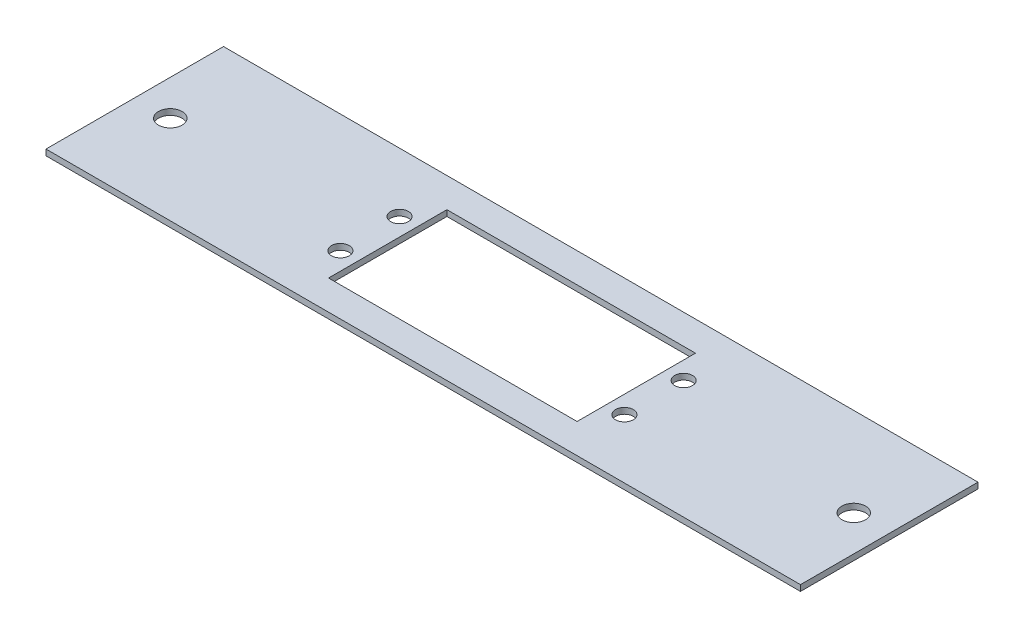
ISO-10303-21;
HEADER;
FILE_DESCRIPTION(('STEP AP214'),'2;1');
FILE_NAME('part.step','',(''),(''),'','','');
FILE_SCHEMA(('AUTOMOTIVE_DESIGN { 1 0 10303 214 1 1 1 1 }'));
ENDSEC;
DATA;
#1=APPLICATION_CONTEXT('core data for automotive mechanical design processes');
#2=APPLICATION_PROTOCOL_DEFINITION('international standard','automotive_design',2000,#1);
#3=PRODUCT_CONTEXT('',#1,'mechanical');
#4=PRODUCT('Part','Part','',(#3));
#5=PRODUCT_RELATED_PRODUCT_CATEGORY('part','',(#4));
#6=PRODUCT_DEFINITION_FORMATION('','',#4);
#7=PRODUCT_DEFINITION_CONTEXT('part definition',#1,'design');
#8=PRODUCT_DEFINITION('design','',#6,#7);
#9=PRODUCT_DEFINITION_SHAPE('','',#8);
#10=(LENGTH_UNIT() NAMED_UNIT(*) SI_UNIT(.MILLI.,.METRE.));
#11=(NAMED_UNIT(*) PLANE_ANGLE_UNIT() SI_UNIT($,.RADIAN.));
#12=(NAMED_UNIT(*) SI_UNIT($,.STERADIAN.) SOLID_ANGLE_UNIT());
#13=UNCERTAINTY_MEASURE_WITH_UNIT(LENGTH_MEASURE(1.E-05),#10,'distance_accuracy_value','');
#14=(GEOMETRIC_REPRESENTATION_CONTEXT(3) GLOBAL_UNCERTAINTY_ASSIGNED_CONTEXT((#13)) GLOBAL_UNIT_ASSIGNED_CONTEXT((#10,
#11,#12)) REPRESENTATION_CONTEXT('',''));
#15=CARTESIAN_POINT('',(0.,0.,0.));
#16=DIRECTION('',(0.,0.,1.));
#17=DIRECTION('',(1.,0.,0.));
#18=AXIS2_PLACEMENT_3D('',#15,#16,#17);
#19=CARTESIAN_POINT('',(0.,1.,0.));
#20=DIRECTION('',(0.,1.,0.));
#21=DIRECTION('',(0.,0.,1.));
#22=AXIS2_PLACEMENT_3D('',#19,#20,#21);
#23=PLANE('',#22);
#24=CARTESIAN_POINT('',(24.,1.,-5.));
#25=DIRECTION('',(0.,1.,0.));
#26=DIRECTION('',(0.,0.,-1.));
#27=AXIS2_PLACEMENT_3D('',#24,#25,#26);
#28=CIRCLE('',#27,1.49999999999999);
#29=CARTESIAN_POINT('',(24.,1.,-6.5));
#30=VERTEX_POINT('',#29);
#31=EDGE_CURVE('E298',#30,#30,#28,.T.);
#32=ORIENTED_EDGE('',*,*,#31,.F.);
#33=EDGE_LOOP('',(#32));
#34=FACE_BOUND('',#33,.T.);
#35=CARTESIAN_POINT('',(24.,1.,4.99999999999999));
#36=DIRECTION('',(0.,1.,0.));
#37=DIRECTION('',(0.,0.,1.));
#38=AXIS2_PLACEMENT_3D('',#35,#36,#37);
#39=CIRCLE('',#38,1.5);
#40=CARTESIAN_POINT('',(24.,1.,6.49999999999999));
#41=VERTEX_POINT('',#40);
#42=EDGE_CURVE('E288',#41,#41,#39,.T.);
#43=ORIENTED_EDGE('',*,*,#42,.F.);
#44=EDGE_LOOP('',(#43));
#45=FACE_BOUND('',#44,.T.);
#46=CARTESIAN_POINT('',(-24.,1.,5.));
#47=DIRECTION('',(0.,1.,0.));
#48=DIRECTION('',(0.,0.,-1.));
#49=AXIS2_PLACEMENT_3D('',#46,#47,#48);
#50=CIRCLE('',#49,1.5);
#51=CARTESIAN_POINT('',(-24.,1.,3.5));
#52=VERTEX_POINT('',#51);
#53=EDGE_CURVE('E278',#52,#52,#50,.T.);
#54=ORIENTED_EDGE('',*,*,#53,.F.);
#55=EDGE_LOOP('',(#54));
#56=FACE_BOUND('',#55,.T.);
#57=CARTESIAN_POINT('',(-24.,1.,-5.));
#58=DIRECTION('',(0.,1.,0.));
#59=DIRECTION('',(0.,0.,1.));
#60=AXIS2_PLACEMENT_3D('',#57,#58,#59);
#61=CIRCLE('',#60,1.5);
#62=CARTESIAN_POINT('',(-24.,1.,-3.5));
#63=VERTEX_POINT('',#62);
#64=EDGE_CURVE('E285',#63,#63,#61,.T.);
#65=ORIENTED_EDGE('',*,*,#64,.F.);
#66=EDGE_LOOP('',(#65));
#67=FACE_BOUND('',#66,.T.);
#68=CARTESIAN_POINT('',(-57.75,1.,0.));
#69=DIRECTION('',(0.,1.,0.));
#70=DIRECTION('',(0.,0.,1.));
#71=AXIS2_PLACEMENT_3D('',#68,#69,#70);
#72=CIRCLE('',#71,2.);
#73=CARTESIAN_POINT('',(-57.75,1.,2.));
#74=VERTEX_POINT('',#73);
#75=EDGE_CURVE('E140',#74,#74,#72,.T.);
#76=ORIENTED_EDGE('',*,*,#75,.F.);
#77=EDGE_LOOP('',(#76));
#78=FACE_BOUND('',#77,.T.);
#79=DIRECTION('',(0.,0.,1.));
#80=VECTOR('',#79,1.);
#81=CARTESIAN_POINT('',(-63.75,1.,-15.));
#82=LINE('',#81,#80);
#83=CARTESIAN_POINT('',(-63.75,1.,-15.));
#84=VERTEX_POINT('',#83);
#85=CARTESIAN_POINT('',(-63.75,1.,15.));
#86=VERTEX_POINT('',#85);
#87=EDGE_CURVE('E156',#84,#86,#82,.T.);
#88=ORIENTED_EDGE('',*,*,#87,.T.);
#89=DIRECTION('',(1.,0.,0.));
#90=VECTOR('',#89,1.);
#91=CARTESIAN_POINT('',(-63.75,1.,15.));
#92=LINE('',#91,#90);
#93=CARTESIAN_POINT('',(63.75,1.,15.));
#94=VERTEX_POINT('',#93);
#95=EDGE_CURVE('E160',#86,#94,#92,.T.);
#96=ORIENTED_EDGE('',*,*,#95,.T.);
#97=DIRECTION('',(0.,0.,-1.));
#98=VECTOR('',#97,1.);
#99=CARTESIAN_POINT('',(63.75,1.,-15.));
#100=LINE('',#99,#98);
#101=CARTESIAN_POINT('',(63.75,1.,-15.));
#102=VERTEX_POINT('',#101);
#103=EDGE_CURVE('E164',#94,#102,#100,.T.);
#104=ORIENTED_EDGE('',*,*,#103,.T.);
#105=DIRECTION('',(-1.,0.,0.));
#106=VECTOR('',#105,1.);
#107=CARTESIAN_POINT('',(-63.75,1.,-15.));
#108=LINE('',#107,#106);
#109=EDGE_CURVE('E167',#102,#84,#108,.T.);
#110=ORIENTED_EDGE('',*,*,#109,.T.);
#111=EDGE_LOOP('',(#88,#96,#104,#110));
#112=FACE_BOUND('',#111,.T.);
#113=DIRECTION('',(-1.,0.,0.));
#114=VECTOR('',#113,1.);
#115=CARTESIAN_POINT('',(-21.,1.,-10.));
#116=LINE('',#115,#114);
#117=CARTESIAN_POINT('',(21.,1.,-10.));
#118=VERTEX_POINT('',#117);
#119=CARTESIAN_POINT('',(-21.,1.,-10.));
#120=VERTEX_POINT('',#119);
#121=EDGE_CURVE('E114',#118,#120,#116,.T.);
#122=ORIENTED_EDGE('',*,*,#121,.F.);
#123=DIRECTION('',(0.,0.,-1.));
#124=VECTOR('',#123,1.);
#125=CARTESIAN_POINT('',(21.,1.,10.));
#126=LINE('',#125,#124);
#127=CARTESIAN_POINT('',(21.,1.,10.));
#128=VERTEX_POINT('',#127);
#129=EDGE_CURVE('E105',#128,#118,#126,.T.);
#130=ORIENTED_EDGE('',*,*,#129,.F.);
#131=DIRECTION('',(1.,0.,0.));
#132=VECTOR('',#131,1.);
#133=CARTESIAN_POINT('',(-21.,1.,10.));
#134=LINE('',#133,#132);
#135=CARTESIAN_POINT('',(-21.,1.,10.));
#136=VERTEX_POINT('',#135);
#137=EDGE_CURVE('E132',#136,#128,#134,.T.);
#138=ORIENTED_EDGE('',*,*,#137,.F.);
#139=DIRECTION('',(0.,0.,1.));
#140=VECTOR('',#139,1.);
#141=CARTESIAN_POINT('',(-21.,1.,10.));
#142=LINE('',#141,#140);
#143=EDGE_CURVE('E128',#120,#136,#142,.T.);
#144=ORIENTED_EDGE('',*,*,#143,.F.);
#145=EDGE_LOOP('',(#122,#130,#138,#144));
#146=FACE_BOUND('',#145,.T.);
#147=CARTESIAN_POINT('',(57.75,1.,0.));
#148=DIRECTION('',(0.,1.,0.));
#149=DIRECTION('',(0.,0.,-1.));
#150=AXIS2_PLACEMENT_3D('',#147,#148,#149);
#151=CIRCLE('',#150,2.00000000000002);
#152=CARTESIAN_POINT('',(57.75,1.,-2.00000000000003));
#153=VERTEX_POINT('',#152);
#154=EDGE_CURVE('E310',#153,#153,#151,.T.);
#155=ORIENTED_EDGE('',*,*,#154,.F.);
#156=EDGE_LOOP('',(#155));
#157=FACE_BOUND('',#156,.T.);
#158=ADVANCED_FACE('F39',(#34,#45,#56,#67,#78,#112,#146,#157),#23,.T.);
#159=CARTESIAN_POINT('',(0.,0.,0.));
#160=DIRECTION('',(0.,1.,0.));
#161=DIRECTION('',(0.,0.,1.));
#162=AXIS2_PLACEMENT_3D('',#159,#160,#161);
#163=PLANE('',#162);
#164=CARTESIAN_POINT('',(24.,0.,-5.));
#165=DIRECTION('',(0.,1.,0.));
#166=DIRECTION('',(0.,0.,-1.));
#167=AXIS2_PLACEMENT_3D('',#164,#165,#166);
#168=CIRCLE('',#167,1.49999999999999);
#169=CARTESIAN_POINT('',(24.,0.,-6.5));
#170=VERTEX_POINT('',#169);
#171=EDGE_CURVE('E294',#170,#170,#168,.T.);
#172=ORIENTED_EDGE('',*,*,#171,.T.);
#173=EDGE_LOOP('',(#172));
#174=FACE_BOUND('',#173,.T.);
#175=CARTESIAN_POINT('',(24.,0.,4.99999999999999));
#176=DIRECTION('',(0.,1.,0.));
#177=DIRECTION('',(0.,0.,1.));
#178=AXIS2_PLACEMENT_3D('',#175,#176,#177);
#179=CIRCLE('',#178,1.5);
#180=CARTESIAN_POINT('',(24.,0.,6.49999999999999));
#181=VERTEX_POINT('',#180);
#182=EDGE_CURVE('E281',#181,#181,#179,.T.);
#183=ORIENTED_EDGE('',*,*,#182,.T.);
#184=EDGE_LOOP('',(#183));
#185=FACE_BOUND('',#184,.T.);
#186=CARTESIAN_POINT('',(-24.,0.,5.));
#187=DIRECTION('',(0.,1.,0.));
#188=DIRECTION('',(0.,0.,-1.));
#189=AXIS2_PLACEMENT_3D('',#186,#187,#188);
#190=CIRCLE('',#189,1.5);
#191=CARTESIAN_POINT('',(-24.,0.,3.5));
#192=VERTEX_POINT('',#191);
#193=EDGE_CURVE('E275',#192,#192,#190,.T.);
#194=ORIENTED_EDGE('',*,*,#193,.T.);
#195=EDGE_LOOP('',(#194));
#196=FACE_BOUND('',#195,.T.);
#197=CARTESIAN_POINT('',(-24.,0.,-5.));
#198=DIRECTION('',(0.,1.,0.));
#199=DIRECTION('',(0.,0.,1.));
#200=AXIS2_PLACEMENT_3D('',#197,#198,#199);
#201=CIRCLE('',#200,1.5);
#202=CARTESIAN_POINT('',(-24.,0.,-3.5));
#203=VERTEX_POINT('',#202);
#204=EDGE_CURVE('E302',#203,#203,#201,.T.);
#205=ORIENTED_EDGE('',*,*,#204,.T.);
#206=EDGE_LOOP('',(#205));
#207=FACE_BOUND('',#206,.T.);
#208=DIRECTION('',(0.,0.,1.));
#209=VECTOR('',#208,1.);
#210=CARTESIAN_POINT('',(-63.75,0.,-15.));
#211=LINE('',#210,#209);
#212=CARTESIAN_POINT('',(-63.75,0.,-15.));
#213=VERTEX_POINT('',#212);
#214=CARTESIAN_POINT('',(-63.75,0.,15.));
#215=VERTEX_POINT('',#214);
#216=EDGE_CURVE('E123',#213,#215,#211,.T.);
#217=ORIENTED_EDGE('',*,*,#216,.F.);
#218=DIRECTION('',(-1.,0.,0.));
#219=VECTOR('',#218,1.);
#220=CARTESIAN_POINT('',(-63.75,0.,-15.));
#221=LINE('',#220,#219);
#222=CARTESIAN_POINT('',(63.75,0.,-15.));
#223=VERTEX_POINT('',#222);
#224=EDGE_CURVE('E161',#223,#213,#221,.T.);
#225=ORIENTED_EDGE('',*,*,#224,.F.);
#226=DIRECTION('',(0.,0.,-1.));
#227=VECTOR('',#226,1.);
#228=CARTESIAN_POINT('',(63.75,0.,-15.));
#229=LINE('',#228,#227);
#230=CARTESIAN_POINT('',(63.75,0.,15.));
#231=VERTEX_POINT('',#230);
#232=EDGE_CURVE('E177',#231,#223,#229,.T.);
#233=ORIENTED_EDGE('',*,*,#232,.F.);
#234=DIRECTION('',(1.,0.,0.));
#235=VECTOR('',#234,1.);
#236=CARTESIAN_POINT('',(-63.75,0.,15.));
#237=LINE('',#236,#235);
#238=EDGE_CURVE('E174',#215,#231,#237,.T.);
#239=ORIENTED_EDGE('',*,*,#238,.F.);
#240=EDGE_LOOP('',(#217,#225,#233,#239));
#241=FACE_BOUND('',#240,.T.);
#242=DIRECTION('',(0.,0.,-1.));
#243=VECTOR('',#242,1.);
#244=CARTESIAN_POINT('',(21.,0.,10.));
#245=LINE('',#244,#243);
#246=CARTESIAN_POINT('',(21.,0.,10.));
#247=VERTEX_POINT('',#246);
#248=CARTESIAN_POINT('',(21.,0.,-10.));
#249=VERTEX_POINT('',#248);
#250=EDGE_CURVE('E63',#247,#249,#245,.T.);
#251=ORIENTED_EDGE('',*,*,#250,.T.);
#252=DIRECTION('',(-1.,0.,0.));
#253=VECTOR('',#252,1.);
#254=CARTESIAN_POINT('',(-21.,0.,-10.));
#255=LINE('',#254,#253);
#256=CARTESIAN_POINT('',(-21.,0.,-10.));
#257=VERTEX_POINT('',#256);
#258=EDGE_CURVE('E121',#249,#257,#255,.T.);
#259=ORIENTED_EDGE('',*,*,#258,.T.);
#260=DIRECTION('',(0.,0.,1.));
#261=VECTOR('',#260,1.);
#262=CARTESIAN_POINT('',(-21.,0.,10.));
#263=LINE('',#262,#261);
#264=CARTESIAN_POINT('',(-21.,0.,10.));
#265=VERTEX_POINT('',#264);
#266=EDGE_CURVE('E143',#257,#265,#263,.T.);
#267=ORIENTED_EDGE('',*,*,#266,.T.);
#268=DIRECTION('',(1.,0.,0.));
#269=VECTOR('',#268,1.);
#270=CARTESIAN_POINT('',(-21.,0.,10.));
#271=LINE('',#270,#269);
#272=EDGE_CURVE('E115',#265,#247,#271,.T.);
#273=ORIENTED_EDGE('',*,*,#272,.T.);
#274=EDGE_LOOP('',(#251,#259,#267,#273));
#275=FACE_BOUND('',#274,.T.);
#276=CARTESIAN_POINT('',(-57.75,0.,0.));
#277=DIRECTION('',(0.,1.,0.));
#278=DIRECTION('',(0.,0.,1.));
#279=AXIS2_PLACEMENT_3D('',#276,#277,#278);
#280=CIRCLE('',#279,2.);
#281=CARTESIAN_POINT('',(-57.75,0.,2.));
#282=VERTEX_POINT('',#281);
#283=EDGE_CURVE('E314',#282,#282,#280,.T.);
#284=ORIENTED_EDGE('',*,*,#283,.T.);
#285=EDGE_LOOP('',(#284));
#286=FACE_BOUND('',#285,.T.);
#287=CARTESIAN_POINT('',(57.75,0.,0.));
#288=DIRECTION('',(0.,1.,0.));
#289=DIRECTION('',(0.,0.,-1.));
#290=AXIS2_PLACEMENT_3D('',#287,#288,#289);
#291=CIRCLE('',#290,2.00000000000002);
#292=CARTESIAN_POINT('',(57.75,0.,-2.00000000000003));
#293=VERTEX_POINT('',#292);
#294=EDGE_CURVE('E306',#293,#293,#291,.T.);
#295=ORIENTED_EDGE('',*,*,#294,.T.);
#296=EDGE_LOOP('',(#295));
#297=FACE_BOUND('',#296,.T.);
#298=ADVANCED_FACE('F200',(#174,#185,#196,#207,#241,#275,#286,#297),#163,.F.);
#299=CARTESIAN_POINT('',(-63.75,1.,-15.));
#300=DIRECTION('',(1.,0.,0.));
#301=DIRECTION('',(0.,0.,-1.));
#302=AXIS2_PLACEMENT_3D('',#299,#300,#301);
#303=PLANE('',#302);
#304=ORIENTED_EDGE('',*,*,#216,.T.);
#305=DIRECTION('',(0.,-1.,0.));
#306=VECTOR('',#305,1.);
#307=CARTESIAN_POINT('',(-63.75,1.,15.));
#308=LINE('',#307,#306);
#309=EDGE_CURVE('E11',#86,#215,#308,.T.);
#310=ORIENTED_EDGE('',*,*,#309,.F.);
#311=ORIENTED_EDGE('',*,*,#87,.F.);
#312=DIRECTION('',(0.,-1.,0.));
#313=VECTOR('',#312,1.);
#314=CARTESIAN_POINT('',(-63.75,1.,-15.));
#315=LINE('',#314,#313);
#316=EDGE_CURVE('E170',#84,#213,#315,.T.);
#317=ORIENTED_EDGE('',*,*,#316,.T.);
#318=EDGE_LOOP('',(#304,#310,#311,#317));
#319=FACE_BOUND('',#318,.T.);
#320=ADVANCED_FACE('F41',(#319),#303,.F.);
#321=CARTESIAN_POINT('',(-63.75,1.,15.));
#322=DIRECTION('',(0.,0.,-1.));
#323=DIRECTION('',(-1.,0.,0.));
#324=AXIS2_PLACEMENT_3D('',#321,#322,#323);
#325=PLANE('',#324);
#326=ORIENTED_EDGE('',*,*,#238,.T.);
#327=DIRECTION('',(0.,-1.,0.));
#328=VECTOR('',#327,1.);
#329=CARTESIAN_POINT('',(63.75,1.,15.));
#330=LINE('',#329,#328);
#331=EDGE_CURVE('E48',#94,#231,#330,.T.);
#332=ORIENTED_EDGE('',*,*,#331,.F.);
#333=ORIENTED_EDGE('',*,*,#95,.F.);
#334=ORIENTED_EDGE('',*,*,#309,.T.);
#335=EDGE_LOOP('',(#326,#332,#333,#334));
#336=FACE_BOUND('',#335,.T.);
#337=ADVANCED_FACE('F210',(#336),#325,.F.);
#338=CARTESIAN_POINT('',(63.75,1.,-15.));
#339=DIRECTION('',(-1.,0.,0.));
#340=DIRECTION('',(0.,0.,1.));
#341=AXIS2_PLACEMENT_3D('',#338,#339,#340);
#342=PLANE('',#341);
#343=ORIENTED_EDGE('',*,*,#232,.T.);
#344=DIRECTION('',(0.,-1.,0.));
#345=VECTOR('',#344,1.);
#346=CARTESIAN_POINT('',(63.75,1.,-15.));
#347=LINE('',#346,#345);
#348=EDGE_CURVE('E185',#102,#223,#347,.T.);
#349=ORIENTED_EDGE('',*,*,#348,.F.);
#350=ORIENTED_EDGE('',*,*,#103,.F.);
#351=ORIENTED_EDGE('',*,*,#331,.T.);
#352=EDGE_LOOP('',(#343,#349,#350,#351));
#353=FACE_BOUND('',#352,.T.);
#354=ADVANCED_FACE('F194',(#353),#342,.F.);
#355=CARTESIAN_POINT('',(-63.75,1.,-15.));
#356=DIRECTION('',(0.,0.,1.));
#357=DIRECTION('',(1.,0.,0.));
#358=AXIS2_PLACEMENT_3D('',#355,#356,#357);
#359=PLANE('',#358);
#360=ORIENTED_EDGE('',*,*,#224,.T.);
#361=ORIENTED_EDGE('',*,*,#316,.F.);
#362=ORIENTED_EDGE('',*,*,#109,.F.);
#363=ORIENTED_EDGE('',*,*,#348,.T.);
#364=EDGE_LOOP('',(#360,#361,#362,#363));
#365=FACE_BOUND('',#364,.T.);
#366=ADVANCED_FACE('F204',(#365),#359,.F.);
#367=CARTESIAN_POINT('',(21.,1.,10.));
#368=DIRECTION('',(-1.,0.,0.));
#369=DIRECTION('',(0.,0.,1.));
#370=AXIS2_PLACEMENT_3D('',#367,#368,#369);
#371=PLANE('',#370);
#372=ORIENTED_EDGE('',*,*,#250,.F.);
#373=DIRECTION('',(0.,-1.,0.));
#374=VECTOR('',#373,1.);
#375=CARTESIAN_POINT('',(21.,1.,10.));
#376=LINE('',#375,#374);
#377=EDGE_CURVE('E109',#128,#247,#376,.T.);
#378=ORIENTED_EDGE('',*,*,#377,.F.);
#379=ORIENTED_EDGE('',*,*,#129,.T.);
#380=DIRECTION('',(0.,-1.,0.));
#381=VECTOR('',#380,1.);
#382=CARTESIAN_POINT('',(21.,1.,-10.));
#383=LINE('',#382,#381);
#384=EDGE_CURVE('E108',#118,#249,#383,.T.);
#385=ORIENTED_EDGE('',*,*,#384,.T.);
#386=EDGE_LOOP('',(#372,#378,#379,#385));
#387=FACE_BOUND('',#386,.T.);
#388=ADVANCED_FACE('F107',(#387),#371,.T.);
#389=CARTESIAN_POINT('',(-21.,1.,-10.));
#390=DIRECTION('',(0.,0.,1.));
#391=DIRECTION('',(1.,0.,0.));
#392=AXIS2_PLACEMENT_3D('',#389,#390,#391);
#393=PLANE('',#392);
#394=ORIENTED_EDGE('',*,*,#258,.F.);
#395=ORIENTED_EDGE('',*,*,#384,.F.);
#396=ORIENTED_EDGE('',*,*,#121,.T.);
#397=DIRECTION('',(0.,-1.,0.));
#398=VECTOR('',#397,1.);
#399=CARTESIAN_POINT('',(-21.,1.,-10.));
#400=LINE('',#399,#398);
#401=EDGE_CURVE('E124',#120,#257,#400,.T.);
#402=ORIENTED_EDGE('',*,*,#401,.T.);
#403=EDGE_LOOP('',(#394,#395,#396,#402));
#404=FACE_BOUND('',#403,.T.);
#405=ADVANCED_FACE('F118',(#404),#393,.T.);
#406=CARTESIAN_POINT('',(-21.,1.,10.));
#407=DIRECTION('',(1.,0.,0.));
#408=DIRECTION('',(0.,0.,-1.));
#409=AXIS2_PLACEMENT_3D('',#406,#407,#408);
#410=PLANE('',#409);
#411=ORIENTED_EDGE('',*,*,#266,.F.);
#412=ORIENTED_EDGE('',*,*,#401,.F.);
#413=ORIENTED_EDGE('',*,*,#143,.T.);
#414=DIRECTION('',(0.,-1.,0.));
#415=VECTOR('',#414,1.);
#416=CARTESIAN_POINT('',(-21.,1.,10.));
#417=LINE('',#416,#415);
#418=EDGE_CURVE('E55',#136,#265,#417,.T.);
#419=ORIENTED_EDGE('',*,*,#418,.T.);
#420=EDGE_LOOP('',(#411,#412,#413,#419));
#421=FACE_BOUND('',#420,.T.);
#422=ADVANCED_FACE('F237',(#421),#410,.T.);
#423=CARTESIAN_POINT('',(-21.,1.,10.));
#424=DIRECTION('',(0.,0.,-1.));
#425=DIRECTION('',(-1.,0.,0.));
#426=AXIS2_PLACEMENT_3D('',#423,#424,#425);
#427=PLANE('',#426);
#428=ORIENTED_EDGE('',*,*,#272,.F.);
#429=ORIENTED_EDGE('',*,*,#418,.F.);
#430=ORIENTED_EDGE('',*,*,#137,.T.);
#431=ORIENTED_EDGE('',*,*,#377,.T.);
#432=EDGE_LOOP('',(#428,#429,#430,#431));
#433=FACE_BOUND('',#432,.T.);
#434=ADVANCED_FACE('F241',(#433),#427,.T.);
#435=CARTESIAN_POINT('',(-57.75,1.,0.));
#436=DIRECTION('',(0.,-1.,0.));
#437=DIRECTION('',(0.,0.,-1.));
#438=AXIS2_PLACEMENT_3D('',#435,#436,#437);
#439=CYLINDRICAL_SURFACE('',#438,2.);
#440=ORIENTED_EDGE('',*,*,#75,.T.);
#441=EDGE_LOOP('',(#440));
#442=FACE_BOUND('',#441,.T.);
#443=ORIENTED_EDGE('',*,*,#283,.F.);
#444=EDGE_LOOP('',(#443));
#445=FACE_BOUND('',#444,.T.);
#446=ADVANCED_FACE('F247',(#442,#445),#439,.F.);
#447=CARTESIAN_POINT('',(57.75,1.,0.));
#448=DIRECTION('',(0.,-1.,0.));
#449=DIRECTION('',(0.,0.,-1.));
#450=AXIS2_PLACEMENT_3D('',#447,#448,#449);
#451=CYLINDRICAL_SURFACE('',#450,2.00000000000002);
#452=ORIENTED_EDGE('',*,*,#154,.T.);
#453=EDGE_LOOP('',(#452));
#454=FACE_BOUND('',#453,.T.);
#455=ORIENTED_EDGE('',*,*,#294,.F.);
#456=EDGE_LOOP('',(#455));
#457=FACE_BOUND('',#456,.T.);
#458=ADVANCED_FACE('F250',(#454,#457),#451,.F.);
#459=CARTESIAN_POINT('',(-24.,0.,-5.));
#460=DIRECTION('',(0.,1.,0.));
#461=DIRECTION('',(0.,0.,1.));
#462=AXIS2_PLACEMENT_3D('',#459,#460,#461);
#463=CYLINDRICAL_SURFACE('',#462,1.5);
#464=ORIENTED_EDGE('',*,*,#204,.F.);
#465=EDGE_LOOP('',(#464));
#466=FACE_BOUND('',#465,.T.);
#467=ORIENTED_EDGE('',*,*,#64,.T.);
#468=EDGE_LOOP('',(#467));
#469=FACE_BOUND('',#468,.T.);
#470=ADVANCED_FACE('F254',(#466,#469),#463,.F.);
#471=CARTESIAN_POINT('',(-24.,0.,5.));
#472=DIRECTION('',(0.,1.,0.));
#473=DIRECTION('',(0.,0.,1.));
#474=AXIS2_PLACEMENT_3D('',#471,#472,#473);
#475=CYLINDRICAL_SURFACE('',#474,1.5);
#476=ORIENTED_EDGE('',*,*,#193,.F.);
#477=EDGE_LOOP('',(#476));
#478=FACE_BOUND('',#477,.T.);
#479=ORIENTED_EDGE('',*,*,#53,.T.);
#480=EDGE_LOOP('',(#479));
#481=FACE_BOUND('',#480,.T.);
#482=ADVANCED_FACE('F258',(#478,#481),#475,.F.);
#483=CARTESIAN_POINT('',(24.,0.,4.99999999999999));
#484=DIRECTION('',(0.,1.,0.));
#485=DIRECTION('',(0.,0.,1.));
#486=AXIS2_PLACEMENT_3D('',#483,#484,#485);
#487=CYLINDRICAL_SURFACE('',#486,1.5);
#488=ORIENTED_EDGE('',*,*,#182,.F.);
#489=EDGE_LOOP('',(#488));
#490=FACE_BOUND('',#489,.T.);
#491=ORIENTED_EDGE('',*,*,#42,.T.);
#492=EDGE_LOOP('',(#491));
#493=FACE_BOUND('',#492,.T.);
#494=ADVANCED_FACE('F263',(#490,#493),#487,.F.);
#495=CARTESIAN_POINT('',(24.,0.,-5.));
#496=DIRECTION('',(0.,1.,0.));
#497=DIRECTION('',(0.,0.,1.));
#498=AXIS2_PLACEMENT_3D('',#495,#496,#497);
#499=CYLINDRICAL_SURFACE('',#498,1.49999999999999);
#500=ORIENTED_EDGE('',*,*,#171,.F.);
#501=EDGE_LOOP('',(#500));
#502=FACE_BOUND('',#501,.T.);
#503=ORIENTED_EDGE('',*,*,#31,.T.);
#504=EDGE_LOOP('',(#503));
#505=FACE_BOUND('',#504,.T.);
#506=ADVANCED_FACE('F260',(#502,#505),#499,.F.);
#507=CLOSED_SHELL('',(#158,#298,#320,#337,#354,#366,#388,#405,#422,#434,#446,#458,#470,#482,
#494,#506));
#508=MANIFOLD_SOLID_BREP('B2',#507);
#509=ADVANCED_BREP_SHAPE_REPRESENTATION('',(#18,#508),#14);
#510=SHAPE_DEFINITION_REPRESENTATION(#9,#509);
ENDSEC;
END-ISO-10303-21;
